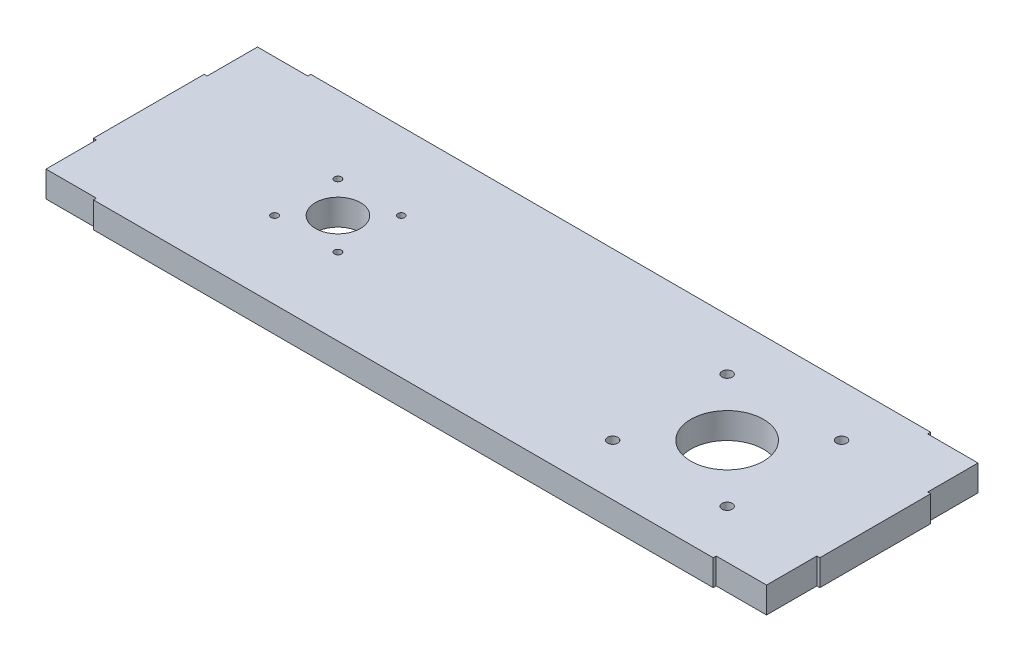
ISO-10303-21;
HEADER;
FILE_DESCRIPTION(('STEP AP214'),'2;1');
FILE_NAME('part.step','',(''),(''),'','','');
FILE_SCHEMA(('AUTOMOTIVE_DESIGN { 1 0 10303 214 1 1 1 1 }'));
ENDSEC;
DATA;
#1=APPLICATION_CONTEXT('core data for automotive mechanical design processes');
#2=APPLICATION_PROTOCOL_DEFINITION('international standard','automotive_design',2000,#1);
#3=PRODUCT_CONTEXT('',#1,'mechanical');
#4=PRODUCT('Part','Part','',(#3));
#5=PRODUCT_RELATED_PRODUCT_CATEGORY('part','',(#4));
#6=PRODUCT_DEFINITION_FORMATION('','',#4);
#7=PRODUCT_DEFINITION_CONTEXT('part definition',#1,'design');
#8=PRODUCT_DEFINITION('design','',#6,#7);
#9=PRODUCT_DEFINITION_SHAPE('','',#8);
#10=(LENGTH_UNIT() NAMED_UNIT(*) SI_UNIT(.MILLI.,.METRE.));
#11=(NAMED_UNIT(*) PLANE_ANGLE_UNIT() SI_UNIT($,.RADIAN.));
#12=(NAMED_UNIT(*) SI_UNIT($,.STERADIAN.) SOLID_ANGLE_UNIT());
#13=UNCERTAINTY_MEASURE_WITH_UNIT(LENGTH_MEASURE(1.E-05),#10,'distance_accuracy_value','');
#14=(GEOMETRIC_REPRESENTATION_CONTEXT(3) GLOBAL_UNCERTAINTY_ASSIGNED_CONTEXT((#13)) GLOBAL_UNIT_ASSIGNED_CONTEXT((#10,
#11,#12)) REPRESENTATION_CONTEXT('',''));
#15=CARTESIAN_POINT('',(0.,0.,0.));
#16=DIRECTION('',(0.,0.,1.));
#17=DIRECTION('',(1.,0.,0.));
#18=AXIS2_PLACEMENT_3D('',#15,#16,#17);
#19=CARTESIAN_POINT('',(-151.7015,12.7,-53.213));
#20=DIRECTION('',(0.,0.,1.));
#21=DIRECTION('',(1.,0.,0.));
#22=AXIS2_PLACEMENT_3D('',#19,#20,#21);
#23=PLANE('',#22);
#24=DIRECTION('',(-1.,0.,0.));
#25=VECTOR('',#24,1.);
#26=CARTESIAN_POINT('',(-151.7015,0.,-53.213));
#27=LINE('',#26,#25);
#28=CARTESIAN_POINT('',(151.7015,0.,-53.213));
#29=VERTEX_POINT('',#28);
#30=CARTESIAN_POINT('',(-151.7015,0.,-53.213));
#31=VERTEX_POINT('',#30);
#32=EDGE_CURVE('E205',#29,#31,#27,.T.);
#33=ORIENTED_EDGE('',*,*,#32,.T.);
#34=DIRECTION('',(0.,-1.,0.));
#35=VECTOR('',#34,1.);
#36=CARTESIAN_POINT('',(-151.7015,12.7,-53.213));
#37=LINE('',#36,#35);
#38=CARTESIAN_POINT('',(-151.7015,12.7,-53.213));
#39=VERTEX_POINT('',#38);
#40=EDGE_CURVE('E11',#39,#31,#37,.T.);
#41=ORIENTED_EDGE('',*,*,#40,.F.);
#42=DIRECTION('',(-1.,0.,0.));
#43=VECTOR('',#42,1.);
#44=CARTESIAN_POINT('',(-151.7015,12.7,-53.213));
#45=LINE('',#44,#43);
#46=CARTESIAN_POINT('',(151.7015,12.7,-53.213));
#47=VERTEX_POINT('',#46);
#48=EDGE_CURVE('E244',#47,#39,#45,.T.);
#49=ORIENTED_EDGE('',*,*,#48,.F.);
#50=DIRECTION('',(0.,-1.,0.));
#51=VECTOR('',#50,1.);
#52=CARTESIAN_POINT('',(151.7015,12.7,-53.213));
#53=LINE('',#52,#51);
#54=EDGE_CURVE('E201',#47,#29,#53,.T.);
#55=ORIENTED_EDGE('',*,*,#54,.T.);
#56=EDGE_LOOP('',(#33,#41,#49,#55));
#57=FACE_BOUND('',#56,.T.);
#58=ADVANCED_FACE('F37',(#57),#23,.F.);
#59=CARTESIAN_POINT('',(-151.7015,12.7,-53.213));
#60=DIRECTION('',(1.,0.,0.));
#61=DIRECTION('',(0.,0.,-1.));
#62=AXIS2_PLACEMENT_3D('',#59,#60,#61);
#63=PLANE('',#62);
#64=DIRECTION('',(0.,0.,1.));
#65=VECTOR('',#64,1.);
#66=CARTESIAN_POINT('',(-151.7015,0.,-53.213));
#67=LINE('',#66,#65);
#68=CARTESIAN_POINT('',(-151.7015,0.,-51.7525));
#69=VERTEX_POINT('',#68);
#70=EDGE_CURVE('E208',#31,#69,#67,.T.);
#71=ORIENTED_EDGE('',*,*,#70,.T.);
#72=DIRECTION('',(0.,-1.,0.));
#73=VECTOR('',#72,1.);
#74=CARTESIAN_POINT('',(-151.7015,12.7,-51.7525));
#75=LINE('',#74,#73);
#76=CARTESIAN_POINT('',(-151.7015,12.7,-51.7525));
#77=VERTEX_POINT('',#76);
#78=EDGE_CURVE('E45',#77,#69,#75,.T.);
#79=ORIENTED_EDGE('',*,*,#78,.F.);
#80=DIRECTION('',(0.,0.,1.));
#81=VECTOR('',#80,1.);
#82=CARTESIAN_POINT('',(-151.7015,12.7,-53.213));
#83=LINE('',#82,#81);
#84=EDGE_CURVE('E132',#39,#77,#83,.T.);
#85=ORIENTED_EDGE('',*,*,#84,.F.);
#86=ORIENTED_EDGE('',*,*,#40,.T.);
#87=EDGE_LOOP('',(#71,#79,#85,#86));
#88=FACE_BOUND('',#87,.T.);
#89=ADVANCED_FACE('F364',(#88),#63,.F.);
#90=CARTESIAN_POINT('',(-151.7015,12.7,-51.7525));
#91=DIRECTION('',(0.,0.,1.));
#92=DIRECTION('',(1.,0.,0.));
#93=AXIS2_PLACEMENT_3D('',#90,#91,#92);
#94=PLANE('',#93);
#95=DIRECTION('',(-1.,0.,0.));
#96=VECTOR('',#95,1.);
#97=CARTESIAN_POINT('',(-151.7015,0.,-51.7525));
#98=LINE('',#97,#96);
#99=CARTESIAN_POINT('',(-176.3395,0.,-51.7525));
#100=VERTEX_POINT('',#99);
#101=EDGE_CURVE('E211',#69,#100,#98,.T.);
#102=ORIENTED_EDGE('',*,*,#101,.T.);
#103=DIRECTION('',(0.,-1.,0.));
#104=VECTOR('',#103,1.);
#105=CARTESIAN_POINT('',(-176.3395,12.7,-51.7525));
#106=LINE('',#105,#104);
#107=CARTESIAN_POINT('',(-176.3395,12.7,-51.7525));
#108=VERTEX_POINT('',#107);
#109=EDGE_CURVE('E287',#108,#100,#106,.T.);
#110=ORIENTED_EDGE('',*,*,#109,.F.);
#111=DIRECTION('',(-1.,0.,0.));
#112=VECTOR('',#111,1.);
#113=CARTESIAN_POINT('',(-151.7015,12.7,-51.7525));
#114=LINE('',#113,#112);
#115=EDGE_CURVE('E295',#77,#108,#114,.T.);
#116=ORIENTED_EDGE('',*,*,#115,.F.);
#117=ORIENTED_EDGE('',*,*,#78,.T.);
#118=EDGE_LOOP('',(#102,#110,#116,#117));
#119=FACE_BOUND('',#118,.T.);
#120=ADVANCED_FACE('F293',(#119),#94,.F.);
#121=CARTESIAN_POINT('',(-176.3395,12.7,-51.7525));
#122=DIRECTION('',(1.,0.,0.));
#123=DIRECTION('',(0.,0.,-1.));
#124=AXIS2_PLACEMENT_3D('',#121,#122,#123);
#125=PLANE('',#124);
#126=DIRECTION('',(0.,0.,1.));
#127=VECTOR('',#126,1.);
#128=CARTESIAN_POINT('',(-176.3395,0.,-51.7525));
#129=LINE('',#128,#127);
#130=CARTESIAN_POINT('',(-176.3395,0.,-27.1145));
#131=VERTEX_POINT('',#130);
#132=EDGE_CURVE('E213',#100,#131,#129,.T.);
#133=ORIENTED_EDGE('',*,*,#132,.T.);
#134=DIRECTION('',(0.,-1.,0.));
#135=VECTOR('',#134,1.);
#136=CARTESIAN_POINT('',(-176.3395,12.7,-27.1145));
#137=LINE('',#136,#135);
#138=CARTESIAN_POINT('',(-176.3395,12.7,-27.1145));
#139=VERTEX_POINT('',#138);
#140=EDGE_CURVE('E284',#139,#131,#137,.T.);
#141=ORIENTED_EDGE('',*,*,#140,.F.);
#142=DIRECTION('',(0.,0.,1.));
#143=VECTOR('',#142,1.);
#144=CARTESIAN_POINT('',(-176.3395,12.7,-51.7525));
#145=LINE('',#144,#143);
#146=EDGE_CURVE('E313',#108,#139,#145,.T.);
#147=ORIENTED_EDGE('',*,*,#146,.F.);
#148=ORIENTED_EDGE('',*,*,#109,.T.);
#149=EDGE_LOOP('',(#133,#141,#147,#148));
#150=FACE_BOUND('',#149,.T.);
#151=ADVANCED_FACE('F304',(#150),#125,.F.);
#152=CARTESIAN_POINT('',(-176.3395,12.7,-27.1145));
#153=DIRECTION('',(0.,0.,1.));
#154=DIRECTION('',(1.,0.,0.));
#155=AXIS2_PLACEMENT_3D('',#152,#153,#154);
#156=PLANE('',#155);
#157=DIRECTION('',(-1.,0.,0.));
#158=VECTOR('',#157,1.);
#159=CARTESIAN_POINT('',(-176.3395,0.,-27.1145));
#160=LINE('',#159,#158);
#161=CARTESIAN_POINT('',(-177.8,0.,-27.1145));
#162=VERTEX_POINT('',#161);
#163=EDGE_CURVE('E215',#131,#162,#160,.T.);
#164=ORIENTED_EDGE('',*,*,#163,.T.);
#165=DIRECTION('',(0.,-1.,0.));
#166=VECTOR('',#165,1.);
#167=CARTESIAN_POINT('',(-177.8,12.7,-27.1145));
#168=LINE('',#167,#166);
#169=CARTESIAN_POINT('',(-177.8,12.7,-27.1145));
#170=VERTEX_POINT('',#169);
#171=EDGE_CURVE('E281',#170,#162,#168,.T.);
#172=ORIENTED_EDGE('',*,*,#171,.F.);
#173=DIRECTION('',(-1.,0.,0.));
#174=VECTOR('',#173,1.);
#175=CARTESIAN_POINT('',(-176.3395,12.7,-27.1145));
#176=LINE('',#175,#174);
#177=EDGE_CURVE('E310',#139,#170,#176,.T.);
#178=ORIENTED_EDGE('',*,*,#177,.F.);
#179=ORIENTED_EDGE('',*,*,#140,.T.);
#180=EDGE_LOOP('',(#164,#172,#178,#179));
#181=FACE_BOUND('',#180,.T.);
#182=ADVANCED_FACE('F308',(#181),#156,.F.);
#183=CARTESIAN_POINT('',(-177.8,12.7,-27.1145));
#184=DIRECTION('',(1.,0.,0.));
#185=DIRECTION('',(0.,0.,-1.));
#186=AXIS2_PLACEMENT_3D('',#183,#184,#185);
#187=PLANE('',#186);
#188=DIRECTION('',(0.,0.,1.));
#189=VECTOR('',#188,1.);
#190=CARTESIAN_POINT('',(-177.8,0.,-27.1145));
#191=LINE('',#190,#189);
#192=CARTESIAN_POINT('',(-177.8,0.,27.1145));
#193=VERTEX_POINT('',#192);
#194=EDGE_CURVE('E217',#162,#193,#191,.T.);
#195=ORIENTED_EDGE('',*,*,#194,.T.);
#196=DIRECTION('',(0.,-1.,0.));
#197=VECTOR('',#196,1.);
#198=CARTESIAN_POINT('',(-177.8,12.7,27.1145));
#199=LINE('',#198,#197);
#200=CARTESIAN_POINT('',(-177.8,12.7,27.1145));
#201=VERTEX_POINT('',#200);
#202=EDGE_CURVE('E278',#201,#193,#199,.T.);
#203=ORIENTED_EDGE('',*,*,#202,.F.);
#204=DIRECTION('',(0.,0.,1.));
#205=VECTOR('',#204,1.);
#206=CARTESIAN_POINT('',(-177.8,12.7,-27.1145));
#207=LINE('',#206,#205);
#208=EDGE_CURVE('E312',#170,#201,#207,.T.);
#209=ORIENTED_EDGE('',*,*,#208,.F.);
#210=ORIENTED_EDGE('',*,*,#171,.T.);
#211=EDGE_LOOP('',(#195,#203,#209,#210));
#212=FACE_BOUND('',#211,.T.);
#213=ADVANCED_FACE('F377',(#212),#187,.F.);
#214=CARTESIAN_POINT('',(-176.3395,12.7,27.1145));
#215=DIRECTION('',(0.,0.,-1.));
#216=DIRECTION('',(-1.,0.,0.));
#217=AXIS2_PLACEMENT_3D('',#214,#215,#216);
#218=PLANE('',#217);
#219=DIRECTION('',(1.,0.,0.));
#220=VECTOR('',#219,1.);
#221=CARTESIAN_POINT('',(-176.3395,0.,27.1145));
#222=LINE('',#221,#220);
#223=CARTESIAN_POINT('',(-176.3395,0.,27.1145));
#224=VERTEX_POINT('',#223);
#225=EDGE_CURVE('E219',#193,#224,#222,.T.);
#226=ORIENTED_EDGE('',*,*,#225,.T.);
#227=DIRECTION('',(0.,-1.,0.));
#228=VECTOR('',#227,1.);
#229=CARTESIAN_POINT('',(-176.3395,12.7,27.1145));
#230=LINE('',#229,#228);
#231=CARTESIAN_POINT('',(-176.3395,12.7,27.1145));
#232=VERTEX_POINT('',#231);
#233=EDGE_CURVE('E275',#232,#224,#230,.T.);
#234=ORIENTED_EDGE('',*,*,#233,.F.);
#235=DIRECTION('',(1.,0.,0.));
#236=VECTOR('',#235,1.);
#237=CARTESIAN_POINT('',(-176.3395,12.7,27.1145));
#238=LINE('',#237,#236);
#239=EDGE_CURVE('E315',#201,#232,#238,.T.);
#240=ORIENTED_EDGE('',*,*,#239,.F.);
#241=ORIENTED_EDGE('',*,*,#202,.T.);
#242=EDGE_LOOP('',(#226,#234,#240,#241));
#243=FACE_BOUND('',#242,.T.);
#244=ADVANCED_FACE('F380',(#243),#218,.F.);
#245=CARTESIAN_POINT('',(-176.3395,12.7,51.7525));
#246=DIRECTION('',(1.,0.,0.));
#247=DIRECTION('',(0.,0.,-1.));
#248=AXIS2_PLACEMENT_3D('',#245,#246,#247);
#249=PLANE('',#248);
#250=DIRECTION('',(0.,0.,1.));
#251=VECTOR('',#250,1.);
#252=CARTESIAN_POINT('',(-176.3395,0.,51.7525));
#253=LINE('',#252,#251);
#254=CARTESIAN_POINT('',(-176.3395,0.,51.7525));
#255=VERTEX_POINT('',#254);
#256=EDGE_CURVE('E221',#224,#255,#253,.T.);
#257=ORIENTED_EDGE('',*,*,#256,.T.);
#258=DIRECTION('',(0.,-1.,0.));
#259=VECTOR('',#258,1.);
#260=CARTESIAN_POINT('',(-176.3395,12.7,51.7525));
#261=LINE('',#260,#259);
#262=CARTESIAN_POINT('',(-176.3395,12.7,51.7525));
#263=VERTEX_POINT('',#262);
#264=EDGE_CURVE('E272',#263,#255,#261,.T.);
#265=ORIENTED_EDGE('',*,*,#264,.F.);
#266=DIRECTION('',(0.,0.,1.));
#267=VECTOR('',#266,1.);
#268=CARTESIAN_POINT('',(-176.3395,12.7,51.7525));
#269=LINE('',#268,#267);
#270=EDGE_CURVE('E321',#232,#263,#269,.T.);
#271=ORIENTED_EDGE('',*,*,#270,.F.);
#272=ORIENTED_EDGE('',*,*,#233,.T.);
#273=EDGE_LOOP('',(#257,#265,#271,#272));
#274=FACE_BOUND('',#273,.T.);
#275=ADVANCED_FACE('F384',(#274),#249,.F.);
#276=CARTESIAN_POINT('',(-151.7015,12.7,51.7525));
#277=DIRECTION('',(0.,0.,-1.));
#278=DIRECTION('',(-1.,0.,0.));
#279=AXIS2_PLACEMENT_3D('',#276,#277,#278);
#280=PLANE('',#279);
#281=DIRECTION('',(1.,0.,0.));
#282=VECTOR('',#281,1.);
#283=CARTESIAN_POINT('',(-151.7015,0.,51.7525));
#284=LINE('',#283,#282);
#285=CARTESIAN_POINT('',(-151.7015,0.,51.7525));
#286=VERTEX_POINT('',#285);
#287=EDGE_CURVE('E223',#255,#286,#284,.T.);
#288=ORIENTED_EDGE('',*,*,#287,.T.);
#289=DIRECTION('',(0.,-1.,0.));
#290=VECTOR('',#289,1.);
#291=CARTESIAN_POINT('',(-151.7015,12.7,51.7525));
#292=LINE('',#291,#290);
#293=CARTESIAN_POINT('',(-151.7015,12.7,51.7525));
#294=VERTEX_POINT('',#293);
#295=EDGE_CURVE('E269',#294,#286,#292,.T.);
#296=ORIENTED_EDGE('',*,*,#295,.F.);
#297=DIRECTION('',(1.,0.,0.));
#298=VECTOR('',#297,1.);
#299=CARTESIAN_POINT('',(-151.7015,12.7,51.7525));
#300=LINE('',#299,#298);
#301=EDGE_CURVE('E323',#263,#294,#300,.T.);
#302=ORIENTED_EDGE('',*,*,#301,.F.);
#303=ORIENTED_EDGE('',*,*,#264,.T.);
#304=EDGE_LOOP('',(#288,#296,#302,#303));
#305=FACE_BOUND('',#304,.T.);
#306=ADVANCED_FACE('F388',(#305),#280,.F.);
#307=CARTESIAN_POINT('',(-151.7015,12.7,53.213));
#308=DIRECTION('',(1.,0.,0.));
#309=DIRECTION('',(0.,0.,-1.));
#310=AXIS2_PLACEMENT_3D('',#307,#308,#309);
#311=PLANE('',#310);
#312=DIRECTION('',(0.,0.,1.));
#313=VECTOR('',#312,1.);
#314=CARTESIAN_POINT('',(-151.7015,0.,53.213));
#315=LINE('',#314,#313);
#316=CARTESIAN_POINT('',(-151.7015,0.,53.213));
#317=VERTEX_POINT('',#316);
#318=EDGE_CURVE('E225',#286,#317,#315,.T.);
#319=ORIENTED_EDGE('',*,*,#318,.T.);
#320=DIRECTION('',(0.,-1.,0.));
#321=VECTOR('',#320,1.);
#322=CARTESIAN_POINT('',(-151.7015,12.7,53.213));
#323=LINE('',#322,#321);
#324=CARTESIAN_POINT('',(-151.7015,12.7,53.213));
#325=VERTEX_POINT('',#324);
#326=EDGE_CURVE('E266',#325,#317,#323,.T.);
#327=ORIENTED_EDGE('',*,*,#326,.F.);
#328=DIRECTION('',(0.,0.,1.));
#329=VECTOR('',#328,1.);
#330=CARTESIAN_POINT('',(-151.7015,12.7,53.213));
#331=LINE('',#330,#329);
#332=EDGE_CURVE('E325',#294,#325,#331,.T.);
#333=ORIENTED_EDGE('',*,*,#332,.F.);
#334=ORIENTED_EDGE('',*,*,#295,.T.);
#335=EDGE_LOOP('',(#319,#327,#333,#334));
#336=FACE_BOUND('',#335,.T.);
#337=ADVANCED_FACE('F392',(#336),#311,.F.);
#338=CARTESIAN_POINT('',(-151.7015,12.7,53.213));
#339=DIRECTION('',(0.,0.,-1.));
#340=DIRECTION('',(-1.,0.,0.));
#341=AXIS2_PLACEMENT_3D('',#338,#339,#340);
#342=PLANE('',#341);
#343=DIRECTION('',(1.,0.,0.));
#344=VECTOR('',#343,1.);
#345=CARTESIAN_POINT('',(-151.7015,0.,53.213));
#346=LINE('',#345,#344);
#347=CARTESIAN_POINT('',(151.7015,0.,53.213));
#348=VERTEX_POINT('',#347);
#349=EDGE_CURVE('E227',#317,#348,#346,.T.);
#350=ORIENTED_EDGE('',*,*,#349,.T.);
#351=DIRECTION('',(0.,-1.,0.));
#352=VECTOR('',#351,1.);
#353=CARTESIAN_POINT('',(151.7015,12.7,53.213));
#354=LINE('',#353,#352);
#355=CARTESIAN_POINT('',(151.7015,12.7,53.213));
#356=VERTEX_POINT('',#355);
#357=EDGE_CURVE('E263',#356,#348,#354,.T.);
#358=ORIENTED_EDGE('',*,*,#357,.F.);
#359=DIRECTION('',(1.,0.,0.));
#360=VECTOR('',#359,1.);
#361=CARTESIAN_POINT('',(-151.7015,12.7,53.213));
#362=LINE('',#361,#360);
#363=EDGE_CURVE('E327',#325,#356,#362,.T.);
#364=ORIENTED_EDGE('',*,*,#363,.F.);
#365=ORIENTED_EDGE('',*,*,#326,.T.);
#366=EDGE_LOOP('',(#350,#358,#364,#365));
#367=FACE_BOUND('',#366,.T.);
#368=ADVANCED_FACE('F396',(#367),#342,.F.);
#369=CARTESIAN_POINT('',(151.7015,12.7,53.213));
#370=DIRECTION('',(-1.,0.,0.));
#371=DIRECTION('',(0.,0.,1.));
#372=AXIS2_PLACEMENT_3D('',#369,#370,#371);
#373=PLANE('',#372);
#374=DIRECTION('',(0.,0.,-1.));
#375=VECTOR('',#374,1.);
#376=CARTESIAN_POINT('',(151.7015,0.,53.213));
#377=LINE('',#376,#375);
#378=CARTESIAN_POINT('',(151.7015,0.,51.7525));
#379=VERTEX_POINT('',#378);
#380=EDGE_CURVE('E229',#348,#379,#377,.T.);
#381=ORIENTED_EDGE('',*,*,#380,.T.);
#382=DIRECTION('',(0.,-1.,0.));
#383=VECTOR('',#382,1.);
#384=CARTESIAN_POINT('',(151.7015,12.7,51.7525));
#385=LINE('',#384,#383);
#386=CARTESIAN_POINT('',(151.7015,12.7,51.7525));
#387=VERTEX_POINT('',#386);
#388=EDGE_CURVE('E260',#387,#379,#385,.T.);
#389=ORIENTED_EDGE('',*,*,#388,.F.);
#390=DIRECTION('',(0.,0.,-1.));
#391=VECTOR('',#390,1.);
#392=CARTESIAN_POINT('',(151.7015,12.7,53.213));
#393=LINE('',#392,#391);
#394=EDGE_CURVE('E329',#356,#387,#393,.T.);
#395=ORIENTED_EDGE('',*,*,#394,.F.);
#396=ORIENTED_EDGE('',*,*,#357,.T.);
#397=EDGE_LOOP('',(#381,#389,#395,#396));
#398=FACE_BOUND('',#397,.T.);
#399=ADVANCED_FACE('F400',(#398),#373,.F.);
#400=CARTESIAN_POINT('',(151.7015,12.7,51.7525));
#401=DIRECTION('',(0.,0.,-1.));
#402=DIRECTION('',(-1.,0.,0.));
#403=AXIS2_PLACEMENT_3D('',#400,#401,#402);
#404=PLANE('',#403);
#405=DIRECTION('',(1.,0.,0.));
#406=VECTOR('',#405,1.);
#407=CARTESIAN_POINT('',(151.7015,0.,51.7525));
#408=LINE('',#407,#406);
#409=CARTESIAN_POINT('',(176.3395,0.,51.7525));
#410=VERTEX_POINT('',#409);
#411=EDGE_CURVE('E231',#379,#410,#408,.T.);
#412=ORIENTED_EDGE('',*,*,#411,.T.);
#413=DIRECTION('',(0.,-1.,0.));
#414=VECTOR('',#413,1.);
#415=CARTESIAN_POINT('',(176.3395,12.7,51.7525));
#416=LINE('',#415,#414);
#417=CARTESIAN_POINT('',(176.3395,12.7,51.7525));
#418=VERTEX_POINT('',#417);
#419=EDGE_CURVE('E257',#418,#410,#416,.T.);
#420=ORIENTED_EDGE('',*,*,#419,.F.);
#421=DIRECTION('',(1.,0.,0.));
#422=VECTOR('',#421,1.);
#423=CARTESIAN_POINT('',(151.7015,12.7,51.7525));
#424=LINE('',#423,#422);
#425=EDGE_CURVE('E331',#387,#418,#424,.T.);
#426=ORIENTED_EDGE('',*,*,#425,.F.);
#427=ORIENTED_EDGE('',*,*,#388,.T.);
#428=EDGE_LOOP('',(#412,#420,#426,#427));
#429=FACE_BOUND('',#428,.T.);
#430=ADVANCED_FACE('F404',(#429),#404,.F.);
#431=CARTESIAN_POINT('',(176.3395,12.7,51.7525));
#432=DIRECTION('',(-1.,0.,0.));
#433=DIRECTION('',(0.,0.,1.));
#434=AXIS2_PLACEMENT_3D('',#431,#432,#433);
#435=PLANE('',#434);
#436=DIRECTION('',(0.,0.,-1.));
#437=VECTOR('',#436,1.);
#438=CARTESIAN_POINT('',(176.3395,0.,51.7525));
#439=LINE('',#438,#437);
#440=CARTESIAN_POINT('',(176.3395,0.,27.1145));
#441=VERTEX_POINT('',#440);
#442=EDGE_CURVE('E233',#410,#441,#439,.T.);
#443=ORIENTED_EDGE('',*,*,#442,.T.);
#444=DIRECTION('',(0.,-1.,0.));
#445=VECTOR('',#444,1.);
#446=CARTESIAN_POINT('',(176.3395,12.7,27.1145));
#447=LINE('',#446,#445);
#448=CARTESIAN_POINT('',(176.3395,12.7,27.1145));
#449=VERTEX_POINT('',#448);
#450=EDGE_CURVE('E254',#449,#441,#447,.T.);
#451=ORIENTED_EDGE('',*,*,#450,.F.);
#452=DIRECTION('',(0.,0.,-1.));
#453=VECTOR('',#452,1.);
#454=CARTESIAN_POINT('',(176.3395,12.7,51.7525));
#455=LINE('',#454,#453);
#456=EDGE_CURVE('E333',#418,#449,#455,.T.);
#457=ORIENTED_EDGE('',*,*,#456,.F.);
#458=ORIENTED_EDGE('',*,*,#419,.T.);
#459=EDGE_LOOP('',(#443,#451,#457,#458));
#460=FACE_BOUND('',#459,.T.);
#461=ADVANCED_FACE('F408',(#460),#435,.F.);
#462=CARTESIAN_POINT('',(176.3395,12.7,27.1145));
#463=DIRECTION('',(0.,0.,-1.));
#464=DIRECTION('',(-1.,0.,0.));
#465=AXIS2_PLACEMENT_3D('',#462,#463,#464);
#466=PLANE('',#465);
#467=DIRECTION('',(1.,0.,0.));
#468=VECTOR('',#467,1.);
#469=CARTESIAN_POINT('',(176.3395,0.,27.1145));
#470=LINE('',#469,#468);
#471=CARTESIAN_POINT('',(177.8,0.,27.1145));
#472=VERTEX_POINT('',#471);
#473=EDGE_CURVE('E235',#441,#472,#470,.T.);
#474=ORIENTED_EDGE('',*,*,#473,.T.);
#475=DIRECTION('',(0.,-1.,0.));
#476=VECTOR('',#475,1.);
#477=CARTESIAN_POINT('',(177.8,12.7,27.1145));
#478=LINE('',#477,#476);
#479=CARTESIAN_POINT('',(177.8,12.7,27.1145));
#480=VERTEX_POINT('',#479);
#481=EDGE_CURVE('E251',#480,#472,#478,.T.);
#482=ORIENTED_EDGE('',*,*,#481,.F.);
#483=DIRECTION('',(1.,0.,0.));
#484=VECTOR('',#483,1.);
#485=CARTESIAN_POINT('',(176.3395,12.7,27.1145));
#486=LINE('',#485,#484);
#487=EDGE_CURVE('E335',#449,#480,#486,.T.);
#488=ORIENTED_EDGE('',*,*,#487,.F.);
#489=ORIENTED_EDGE('',*,*,#450,.T.);
#490=EDGE_LOOP('',(#474,#482,#488,#489));
#491=FACE_BOUND('',#490,.T.);
#492=ADVANCED_FACE('F412',(#491),#466,.F.);
#493=CARTESIAN_POINT('',(177.8,12.7,-27.1145));
#494=DIRECTION('',(-1.,0.,0.));
#495=DIRECTION('',(0.,0.,1.));
#496=AXIS2_PLACEMENT_3D('',#493,#494,#495);
#497=PLANE('',#496);
#498=DIRECTION('',(0.,0.,-1.));
#499=VECTOR('',#498,1.);
#500=CARTESIAN_POINT('',(177.8,0.,-27.1145));
#501=LINE('',#500,#499);
#502=CARTESIAN_POINT('',(177.8,0.,-27.1145));
#503=VERTEX_POINT('',#502);
#504=EDGE_CURVE('E237',#472,#503,#501,.T.);
#505=ORIENTED_EDGE('',*,*,#504,.T.);
#506=DIRECTION('',(0.,-1.,0.));
#507=VECTOR('',#506,1.);
#508=CARTESIAN_POINT('',(177.8,12.7,-27.1145));
#509=LINE('',#508,#507);
#510=CARTESIAN_POINT('',(177.8,12.7,-27.1145));
#511=VERTEX_POINT('',#510);
#512=EDGE_CURVE('E248',#511,#503,#509,.T.);
#513=ORIENTED_EDGE('',*,*,#512,.F.);
#514=DIRECTION('',(0.,0.,-1.));
#515=VECTOR('',#514,1.);
#516=CARTESIAN_POINT('',(177.8,12.7,-27.1145));
#517=LINE('',#516,#515);
#518=EDGE_CURVE('E337',#480,#511,#517,.T.);
#519=ORIENTED_EDGE('',*,*,#518,.F.);
#520=ORIENTED_EDGE('',*,*,#481,.T.);
#521=EDGE_LOOP('',(#505,#513,#519,#520));
#522=FACE_BOUND('',#521,.T.);
#523=ADVANCED_FACE('F343',(#522),#497,.F.);
#524=CARTESIAN_POINT('',(176.3395,12.7,-27.1145));
#525=DIRECTION('',(0.,0.,1.));
#526=DIRECTION('',(1.,0.,0.));
#527=AXIS2_PLACEMENT_3D('',#524,#525,#526);
#528=PLANE('',#527);
#529=DIRECTION('',(-1.,0.,0.));
#530=VECTOR('',#529,1.);
#531=CARTESIAN_POINT('',(176.3395,0.,-27.1145));
#532=LINE('',#531,#530);
#533=CARTESIAN_POINT('',(176.3395,0.,-27.1145));
#534=VERTEX_POINT('',#533);
#535=EDGE_CURVE('E239',#503,#534,#532,.T.);
#536=ORIENTED_EDGE('',*,*,#535,.T.);
#537=DIRECTION('',(0.,-1.,0.));
#538=VECTOR('',#537,1.);
#539=CARTESIAN_POINT('',(176.3395,12.7,-27.1145));
#540=LINE('',#539,#538);
#541=CARTESIAN_POINT('',(176.3395,12.7,-27.1145));
#542=VERTEX_POINT('',#541);
#543=EDGE_CURVE('E196',#542,#534,#540,.T.);
#544=ORIENTED_EDGE('',*,*,#543,.F.);
#545=DIRECTION('',(-1.,0.,0.));
#546=VECTOR('',#545,1.);
#547=CARTESIAN_POINT('',(176.3395,12.7,-27.1145));
#548=LINE('',#547,#546);
#549=EDGE_CURVE('E187',#511,#542,#548,.T.);
#550=ORIENTED_EDGE('',*,*,#549,.F.);
#551=ORIENTED_EDGE('',*,*,#512,.T.);
#552=EDGE_LOOP('',(#536,#544,#550,#551));
#553=FACE_BOUND('',#552,.T.);
#554=ADVANCED_FACE('F347',(#553),#528,.F.);
#555=CARTESIAN_POINT('',(176.3395,12.7,-51.7525));
#556=DIRECTION('',(-1.,0.,0.));
#557=DIRECTION('',(0.,0.,1.));
#558=AXIS2_PLACEMENT_3D('',#555,#556,#557);
#559=PLANE('',#558);
#560=DIRECTION('',(0.,0.,-1.));
#561=VECTOR('',#560,1.);
#562=CARTESIAN_POINT('',(176.3395,0.,-51.7525));
#563=LINE('',#562,#561);
#564=CARTESIAN_POINT('',(176.3395,0.,-51.7525));
#565=VERTEX_POINT('',#564);
#566=EDGE_CURVE('E195',#534,#565,#563,.T.);
#567=ORIENTED_EDGE('',*,*,#566,.T.);
#568=DIRECTION('',(0.,-1.,0.));
#569=VECTOR('',#568,1.);
#570=CARTESIAN_POINT('',(176.3395,12.7,-51.7525));
#571=LINE('',#570,#569);
#572=CARTESIAN_POINT('',(176.3395,12.7,-51.7525));
#573=VERTEX_POINT('',#572);
#574=EDGE_CURVE('E192',#573,#565,#571,.T.);
#575=ORIENTED_EDGE('',*,*,#574,.F.);
#576=DIRECTION('',(0.,0.,-1.));
#577=VECTOR('',#576,1.);
#578=CARTESIAN_POINT('',(176.3395,12.7,-51.7525));
#579=LINE('',#578,#577);
#580=EDGE_CURVE('E181',#542,#573,#579,.T.);
#581=ORIENTED_EDGE('',*,*,#580,.F.);
#582=ORIENTED_EDGE('',*,*,#543,.T.);
#583=EDGE_LOOP('',(#567,#575,#581,#582));
#584=FACE_BOUND('',#583,.T.);
#585=ADVANCED_FACE('F193',(#584),#559,.F.);
#586=CARTESIAN_POINT('',(151.7015,12.7,-51.7525));
#587=DIRECTION('',(0.,0.,1.));
#588=DIRECTION('',(1.,0.,0.));
#589=AXIS2_PLACEMENT_3D('',#586,#587,#588);
#590=PLANE('',#589);
#591=DIRECTION('',(-1.,0.,0.));
#592=VECTOR('',#591,1.);
#593=CARTESIAN_POINT('',(151.7015,0.,-51.7525));
#594=LINE('',#593,#592);
#595=CARTESIAN_POINT('',(151.7015,0.,-51.7525));
#596=VERTEX_POINT('',#595);
#597=EDGE_CURVE('E118',#565,#596,#594,.T.);
#598=ORIENTED_EDGE('',*,*,#597,.T.);
#599=DIRECTION('',(0.,-1.,0.));
#600=VECTOR('',#599,1.);
#601=CARTESIAN_POINT('',(151.7015,12.7,-51.7525));
#602=LINE('',#601,#600);
#603=CARTESIAN_POINT('',(151.7015,12.7,-51.7525));
#604=VERTEX_POINT('',#603);
#605=EDGE_CURVE('E197',#604,#596,#602,.T.);
#606=ORIENTED_EDGE('',*,*,#605,.F.);
#607=DIRECTION('',(-1.,0.,0.));
#608=VECTOR('',#607,1.);
#609=CARTESIAN_POINT('',(151.7015,12.7,-51.7525));
#610=LINE('',#609,#608);
#611=EDGE_CURVE('E185',#573,#604,#610,.T.);
#612=ORIENTED_EDGE('',*,*,#611,.F.);
#613=ORIENTED_EDGE('',*,*,#574,.T.);
#614=EDGE_LOOP('',(#598,#606,#612,#613));
#615=FACE_BOUND('',#614,.T.);
#616=ADVANCED_FACE('F199',(#615),#590,.F.);
#617=CARTESIAN_POINT('',(151.7015,12.7,-53.213));
#618=DIRECTION('',(-1.,0.,0.));
#619=DIRECTION('',(0.,0.,1.));
#620=AXIS2_PLACEMENT_3D('',#617,#618,#619);
#621=PLANE('',#620);
#622=DIRECTION('',(0.,0.,-1.));
#623=VECTOR('',#622,1.);
#624=CARTESIAN_POINT('',(151.7015,0.,-53.213));
#625=LINE('',#624,#623);
#626=EDGE_CURVE('E124',#596,#29,#625,.T.);
#627=ORIENTED_EDGE('',*,*,#626,.T.);
#628=ORIENTED_EDGE('',*,*,#54,.F.);
#629=DIRECTION('',(0.,0.,-1.));
#630=VECTOR('',#629,1.);
#631=CARTESIAN_POINT('',(151.7015,12.7,-53.213));
#632=LINE('',#631,#630);
#633=EDGE_CURVE('E53',#604,#47,#632,.T.);
#634=ORIENTED_EDGE('',*,*,#633,.F.);
#635=ORIENTED_EDGE('',*,*,#605,.T.);
#636=EDGE_LOOP('',(#627,#628,#634,#635));
#637=FACE_BOUND('',#636,.T.);
#638=ADVANCED_FACE('F351',(#637),#621,.F.);
#639=CARTESIAN_POINT('',(0.,12.7,0.));
#640=DIRECTION('',(0.,-1.,0.));
#641=DIRECTION('',(0.,0.,-1.));
#642=AXIS2_PLACEMENT_3D('',#639,#640,#641);
#643=PLANE('',#642);
#644=CARTESIAN_POINT('',(105.3,12.7,0.));
#645=DIRECTION('',(0.,1.,0.));
#646=DIRECTION('',(0.,0.,1.));
#647=AXIS2_PLACEMENT_3D('',#644,#645,#646);
#648=CIRCLE('',#647,17.78);
#649=CARTESIAN_POINT('',(105.3,12.7,17.78));
#650=VERTEX_POINT('',#649);
#651=EDGE_CURVE('E553',#650,#650,#648,.T.);
#652=ORIENTED_EDGE('',*,*,#651,.F.);
#653=EDGE_LOOP('',(#652));
#654=FACE_BOUND('',#653,.T.);
#655=CARTESIAN_POINT('',(77.3,12.7,-28.));
#656=DIRECTION('',(0.,1.,0.));
#657=DIRECTION('',(0.,0.,1.));
#658=AXIS2_PLACEMENT_3D('',#655,#656,#657);
#659=CIRCLE('',#658,2.5);
#660=CARTESIAN_POINT('',(77.3,12.7,-25.5));
#661=VERTEX_POINT('',#660);
#662=EDGE_CURVE('E557',#661,#661,#659,.T.);
#663=ORIENTED_EDGE('',*,*,#662,.F.);
#664=EDGE_LOOP('',(#663));
#665=FACE_BOUND('',#664,.T.);
#666=CARTESIAN_POINT('',(133.3,12.7,-28.));
#667=DIRECTION('',(0.,1.,0.));
#668=DIRECTION('',(0.,0.,-1.));
#669=AXIS2_PLACEMENT_3D('',#666,#667,#668);
#670=CIRCLE('',#669,2.5);
#671=CARTESIAN_POINT('',(133.3,12.7,-30.5));
#672=VERTEX_POINT('',#671);
#673=EDGE_CURVE('E570',#672,#672,#670,.T.);
#674=ORIENTED_EDGE('',*,*,#673,.F.);
#675=EDGE_LOOP('',(#674));
#676=FACE_BOUND('',#675,.T.);
#677=CARTESIAN_POINT('',(77.3,12.7,28.));
#678=DIRECTION('',(0.,1.,0.));
#679=DIRECTION('',(0.,0.,-1.));
#680=AXIS2_PLACEMENT_3D('',#677,#678,#679);
#681=CIRCLE('',#680,2.5);
#682=CARTESIAN_POINT('',(77.3,12.7,25.5));
#683=VERTEX_POINT('',#682);
#684=EDGE_CURVE('E563',#683,#683,#681,.T.);
#685=ORIENTED_EDGE('',*,*,#684,.F.);
#686=EDGE_LOOP('',(#685));
#687=FACE_BOUND('',#686,.T.);
#688=CARTESIAN_POINT('',(-85.2000000000001,12.7,0.));
#689=DIRECTION('',(0.,1.,0.));
#690=DIRECTION('',(0.,0.,1.));
#691=AXIS2_PLACEMENT_3D('',#688,#689,#690);
#692=CIRCLE('',#691,11.);
#693=CARTESIAN_POINT('',(-85.2000000000001,12.7,11.));
#694=VERTEX_POINT('',#693);
#695=EDGE_CURVE('E559',#694,#694,#692,.T.);
#696=ORIENTED_EDGE('',*,*,#695,.F.);
#697=EDGE_LOOP('',(#696));
#698=FACE_BOUND('',#697,.T.);
#699=CARTESIAN_POINT('',(-100.7,12.7,-15.5));
#700=DIRECTION('',(0.,1.,0.));
#701=DIRECTION('',(0.,0.,1.));
#702=AXIS2_PLACEMENT_3D('',#699,#700,#701);
#703=CIRCLE('',#702,1.70000000000001);
#704=CARTESIAN_POINT('',(-100.7,12.7,-13.8));
#705=VERTEX_POINT('',#704);
#706=EDGE_CURVE('E581',#705,#705,#703,.T.);
#707=ORIENTED_EDGE('',*,*,#706,.F.);
#708=EDGE_LOOP('',(#707));
#709=FACE_BOUND('',#708,.T.);
#710=CARTESIAN_POINT('',(-69.7000000000001,12.7,-15.5));
#711=DIRECTION('',(0.,1.,0.));
#712=DIRECTION('',(0.,0.,-1.));
#713=AXIS2_PLACEMENT_3D('',#710,#711,#712);
#714=CIRCLE('',#713,1.70000000000001);
#715=CARTESIAN_POINT('',(-69.7000000000001,12.7,-17.2));
#716=VERTEX_POINT('',#715);
#717=EDGE_CURVE('E587',#716,#716,#714,.T.);
#718=ORIENTED_EDGE('',*,*,#717,.F.);
#719=EDGE_LOOP('',(#718));
#720=FACE_BOUND('',#719,.T.);
#721=CARTESIAN_POINT('',(-69.7000000000001,12.7,15.5));
#722=DIRECTION('',(0.,1.,0.));
#723=DIRECTION('',(0.,0.,1.));
#724=AXIS2_PLACEMENT_3D('',#721,#722,#723);
#725=CIRCLE('',#724,1.70000000000001);
#726=CARTESIAN_POINT('',(-69.7000000000001,12.7,17.2));
#727=VERTEX_POINT('',#726);
#728=EDGE_CURVE('E593',#727,#727,#725,.T.);
#729=ORIENTED_EDGE('',*,*,#728,.F.);
#730=EDGE_LOOP('',(#729));
#731=FACE_BOUND('',#730,.T.);
#732=CARTESIAN_POINT('',(-100.7,12.7,15.5));
#733=DIRECTION('',(0.,1.,0.));
#734=DIRECTION('',(0.,0.,-1.));
#735=AXIS2_PLACEMENT_3D('',#732,#733,#734);
#736=CIRCLE('',#735,1.70000000000001);
#737=CARTESIAN_POINT('',(-100.7,12.7,13.8));
#738=VERTEX_POINT('',#737);
#739=EDGE_CURVE('E599',#738,#738,#736,.T.);
#740=ORIENTED_EDGE('',*,*,#739,.F.);
#741=EDGE_LOOP('',(#740));
#742=FACE_BOUND('',#741,.T.);
#743=CARTESIAN_POINT('',(133.3,12.7,28.));
#744=DIRECTION('',(0.,1.,0.));
#745=DIRECTION('',(0.,0.,1.));
#746=AXIS2_PLACEMENT_3D('',#743,#744,#745);
#747=CIRCLE('',#746,2.5);
#748=CARTESIAN_POINT('',(133.3,12.7,30.5));
#749=VERTEX_POINT('',#748);
#750=EDGE_CURVE('E209',#749,#749,#747,.T.);
#751=ORIENTED_EDGE('',*,*,#750,.F.);
#752=EDGE_LOOP('',(#751));
#753=FACE_BOUND('',#752,.T.);
#754=ORIENTED_EDGE('',*,*,#48,.T.);
#755=ORIENTED_EDGE('',*,*,#84,.T.);
#756=ORIENTED_EDGE('',*,*,#115,.T.);
#757=ORIENTED_EDGE('',*,*,#146,.T.);
#758=ORIENTED_EDGE('',*,*,#177,.T.);
#759=ORIENTED_EDGE('',*,*,#208,.T.);
#760=ORIENTED_EDGE('',*,*,#239,.T.);
#761=ORIENTED_EDGE('',*,*,#270,.T.);
#762=ORIENTED_EDGE('',*,*,#301,.T.);
#763=ORIENTED_EDGE('',*,*,#332,.T.);
#764=ORIENTED_EDGE('',*,*,#363,.T.);
#765=ORIENTED_EDGE('',*,*,#394,.T.);
#766=ORIENTED_EDGE('',*,*,#425,.T.);
#767=ORIENTED_EDGE('',*,*,#456,.T.);
#768=ORIENTED_EDGE('',*,*,#487,.T.);
#769=ORIENTED_EDGE('',*,*,#518,.T.);
#770=ORIENTED_EDGE('',*,*,#549,.T.);
#771=ORIENTED_EDGE('',*,*,#580,.T.);
#772=ORIENTED_EDGE('',*,*,#611,.T.);
#773=ORIENTED_EDGE('',*,*,#633,.T.);
#774=EDGE_LOOP('',(#754,#755,#756,#757,#758,#759,#760,#761,#762,#763,#764,#765,#766,#767,#768,
#769,#770,#771,#772,#773));
#775=FACE_BOUND('',#774,.T.);
#776=ADVANCED_FACE('F183',(#654,#665,#676,#687,#698,#709,#720,#731,#742,#753,#775),#643,.F.);
#777=CARTESIAN_POINT('',(0.,0.,0.));
#778=DIRECTION('',(0.,-1.,0.));
#779=DIRECTION('',(0.,0.,-1.));
#780=AXIS2_PLACEMENT_3D('',#777,#778,#779);
#781=PLANE('',#780);
#782=CARTESIAN_POINT('',(105.3,0.,0.));
#783=DIRECTION('',(0.,-1.,0.));
#784=DIRECTION('',(0.,0.,-1.));
#785=AXIS2_PLACEMENT_3D('',#782,#783,#784);
#786=CIRCLE('',#785,17.78);
#787=CARTESIAN_POINT('',(105.3,0.,-17.78));
#788=VERTEX_POINT('',#787);
#789=EDGE_CURVE('E550',#788,#788,#786,.F.);
#790=ORIENTED_EDGE('',*,*,#789,.T.);
#791=EDGE_LOOP('',(#790));
#792=FACE_BOUND('',#791,.T.);
#793=CARTESIAN_POINT('',(77.3,0.,-28.));
#794=DIRECTION('',(0.,-1.,0.));
#795=DIRECTION('',(0.,0.,-1.));
#796=AXIS2_PLACEMENT_3D('',#793,#794,#795);
#797=CIRCLE('',#796,2.5);
#798=CARTESIAN_POINT('',(77.3,0.,-30.5));
#799=VERTEX_POINT('',#798);
#800=EDGE_CURVE('E554',#799,#799,#797,.F.);
#801=ORIENTED_EDGE('',*,*,#800,.T.);
#802=EDGE_LOOP('',(#801));
#803=FACE_BOUND('',#802,.T.);
#804=CARTESIAN_POINT('',(133.3,0.,-28.));
#805=DIRECTION('',(0.,-1.,0.));
#806=DIRECTION('',(0.,0.,-1.));
#807=AXIS2_PLACEMENT_3D('',#804,#805,#806);
#808=CIRCLE('',#807,2.5);
#809=CARTESIAN_POINT('',(133.3,0.,-30.5));
#810=VERTEX_POINT('',#809);
#811=EDGE_CURVE('E573',#810,#810,#808,.F.);
#812=ORIENTED_EDGE('',*,*,#811,.T.);
#813=EDGE_LOOP('',(#812));
#814=FACE_BOUND('',#813,.T.);
#815=CARTESIAN_POINT('',(77.3,0.,28.));
#816=DIRECTION('',(0.,-1.,0.));
#817=DIRECTION('',(0.,0.,-1.));
#818=AXIS2_PLACEMENT_3D('',#815,#816,#817);
#819=CIRCLE('',#818,2.5);
#820=CARTESIAN_POINT('',(77.3,0.,25.5));
#821=VERTEX_POINT('',#820);
#822=EDGE_CURVE('E567',#821,#821,#819,.F.);
#823=ORIENTED_EDGE('',*,*,#822,.T.);
#824=EDGE_LOOP('',(#823));
#825=FACE_BOUND('',#824,.T.);
#826=CARTESIAN_POINT('',(-85.2000000000001,0.,0.));
#827=DIRECTION('',(0.,-1.,0.));
#828=DIRECTION('',(0.,0.,-1.));
#829=AXIS2_PLACEMENT_3D('',#826,#827,#828);
#830=CIRCLE('',#829,11.);
#831=CARTESIAN_POINT('',(-85.2000000000001,0.,-11.));
#832=VERTEX_POINT('',#831);
#833=EDGE_CURVE('E578',#832,#832,#830,.F.);
#834=ORIENTED_EDGE('',*,*,#833,.T.);
#835=EDGE_LOOP('',(#834));
#836=FACE_BOUND('',#835,.T.);
#837=CARTESIAN_POINT('',(-100.7,0.,-15.5));
#838=DIRECTION('',(0.,-1.,0.));
#839=DIRECTION('',(0.,0.,-1.));
#840=AXIS2_PLACEMENT_3D('',#837,#838,#839);
#841=CIRCLE('',#840,1.70000000000001);
#842=CARTESIAN_POINT('',(-100.7,0.,-17.2));
#843=VERTEX_POINT('',#842);
#844=EDGE_CURVE('E584',#843,#843,#841,.F.);
#845=ORIENTED_EDGE('',*,*,#844,.T.);
#846=EDGE_LOOP('',(#845));
#847=FACE_BOUND('',#846,.T.);
#848=CARTESIAN_POINT('',(-69.7000000000001,0.,-15.5));
#849=DIRECTION('',(0.,-1.,0.));
#850=DIRECTION('',(0.,0.,-1.));
#851=AXIS2_PLACEMENT_3D('',#848,#849,#850);
#852=CIRCLE('',#851,1.70000000000001);
#853=CARTESIAN_POINT('',(-69.7000000000001,0.,-17.2));
#854=VERTEX_POINT('',#853);
#855=EDGE_CURVE('E590',#854,#854,#852,.F.);
#856=ORIENTED_EDGE('',*,*,#855,.T.);
#857=EDGE_LOOP('',(#856));
#858=FACE_BOUND('',#857,.T.);
#859=CARTESIAN_POINT('',(-69.7000000000001,0.,15.5));
#860=DIRECTION('',(0.,-1.,0.));
#861=DIRECTION('',(0.,0.,-1.));
#862=AXIS2_PLACEMENT_3D('',#859,#860,#861);
#863=CIRCLE('',#862,1.70000000000001);
#864=CARTESIAN_POINT('',(-69.7000000000001,0.,13.8));
#865=VERTEX_POINT('',#864);
#866=EDGE_CURVE('E596',#865,#865,#863,.F.);
#867=ORIENTED_EDGE('',*,*,#866,.T.);
#868=EDGE_LOOP('',(#867));
#869=FACE_BOUND('',#868,.T.);
#870=CARTESIAN_POINT('',(-100.7,0.,15.5));
#871=DIRECTION('',(0.,-1.,0.));
#872=DIRECTION('',(0.,0.,-1.));
#873=AXIS2_PLACEMENT_3D('',#870,#871,#872);
#874=CIRCLE('',#873,1.70000000000001);
#875=CARTESIAN_POINT('',(-100.7,0.,13.8));
#876=VERTEX_POINT('',#875);
#877=EDGE_CURVE('E613',#876,#876,#874,.F.);
#878=ORIENTED_EDGE('',*,*,#877,.T.);
#879=EDGE_LOOP('',(#878));
#880=FACE_BOUND('',#879,.T.);
#881=CARTESIAN_POINT('',(133.3,0.,28.));
#882=DIRECTION('',(0.,-1.,0.));
#883=DIRECTION('',(0.,0.,-1.));
#884=AXIS2_PLACEMENT_3D('',#881,#882,#883);
#885=CIRCLE('',#884,2.5);
#886=CARTESIAN_POINT('',(133.3,0.,25.5));
#887=VERTEX_POINT('',#886);
#888=EDGE_CURVE('E566',#887,#887,#885,.F.);
#889=ORIENTED_EDGE('',*,*,#888,.T.);
#890=EDGE_LOOP('',(#889));
#891=FACE_BOUND('',#890,.T.);
#892=ORIENTED_EDGE('',*,*,#32,.F.);
#893=ORIENTED_EDGE('',*,*,#626,.F.);
#894=ORIENTED_EDGE('',*,*,#597,.F.);
#895=ORIENTED_EDGE('',*,*,#566,.F.);
#896=ORIENTED_EDGE('',*,*,#535,.F.);
#897=ORIENTED_EDGE('',*,*,#504,.F.);
#898=ORIENTED_EDGE('',*,*,#473,.F.);
#899=ORIENTED_EDGE('',*,*,#442,.F.);
#900=ORIENTED_EDGE('',*,*,#411,.F.);
#901=ORIENTED_EDGE('',*,*,#380,.F.);
#902=ORIENTED_EDGE('',*,*,#349,.F.);
#903=ORIENTED_EDGE('',*,*,#318,.F.);
#904=ORIENTED_EDGE('',*,*,#287,.F.);
#905=ORIENTED_EDGE('',*,*,#256,.F.);
#906=ORIENTED_EDGE('',*,*,#225,.F.);
#907=ORIENTED_EDGE('',*,*,#194,.F.);
#908=ORIENTED_EDGE('',*,*,#163,.F.);
#909=ORIENTED_EDGE('',*,*,#132,.F.);
#910=ORIENTED_EDGE('',*,*,#101,.F.);
#911=ORIENTED_EDGE('',*,*,#70,.F.);
#912=EDGE_LOOP('',(#892,#893,#894,#895,#896,#897,#898,#899,#900,#901,#902,#903,#904,#905,#906,
#907,#908,#909,#910,#911));
#913=FACE_BOUND('',#912,.T.);
#914=ADVANCED_FACE('F299',(#792,#803,#814,#825,#836,#847,#858,#869,#880,#891,#913),#781,.T.);
#915=CARTESIAN_POINT('',(133.3,-0.000999999999999265,28.));
#916=DIRECTION('',(0.,1.,0.));
#917=DIRECTION('',(0.,0.,1.));
#918=AXIS2_PLACEMENT_3D('',#915,#916,#917);
#919=CYLINDRICAL_SURFACE('',#918,2.5);
#920=ORIENTED_EDGE('',*,*,#888,.F.);
#921=EDGE_LOOP('',(#920));
#922=FACE_BOUND('',#921,.T.);
#923=ORIENTED_EDGE('',*,*,#750,.T.);
#924=EDGE_LOOP('',(#923));
#925=FACE_BOUND('',#924,.T.);
#926=ADVANCED_FACE('F445',(#922,#925),#919,.F.);
#927=CARTESIAN_POINT('',(-100.7,-0.000999999999999265,15.5));
#928=DIRECTION('',(0.,1.,0.));
#929=DIRECTION('',(0.,0.,1.));
#930=AXIS2_PLACEMENT_3D('',#927,#928,#929);
#931=CYLINDRICAL_SURFACE('',#930,1.70000000000001);
#932=ORIENTED_EDGE('',*,*,#877,.F.);
#933=EDGE_LOOP('',(#932));
#934=FACE_BOUND('',#933,.T.);
#935=ORIENTED_EDGE('',*,*,#739,.T.);
#936=EDGE_LOOP('',(#935));
#937=FACE_BOUND('',#936,.T.);
#938=ADVANCED_FACE('F453',(#934,#937),#931,.F.);
#939=CARTESIAN_POINT('',(-69.7000000000001,-0.000999999999999265,15.5));
#940=DIRECTION('',(0.,1.,0.));
#941=DIRECTION('',(0.,0.,1.));
#942=AXIS2_PLACEMENT_3D('',#939,#940,#941);
#943=CYLINDRICAL_SURFACE('',#942,1.70000000000001);
#944=ORIENTED_EDGE('',*,*,#866,.F.);
#945=EDGE_LOOP('',(#944));
#946=FACE_BOUND('',#945,.T.);
#947=ORIENTED_EDGE('',*,*,#728,.T.);
#948=EDGE_LOOP('',(#947));
#949=FACE_BOUND('',#948,.T.);
#950=ADVANCED_FACE('F463',(#946,#949),#943,.F.);
#951=CARTESIAN_POINT('',(-69.7000000000001,-0.000999999999999265,-15.5));
#952=DIRECTION('',(0.,1.,0.));
#953=DIRECTION('',(0.,0.,1.));
#954=AXIS2_PLACEMENT_3D('',#951,#952,#953);
#955=CYLINDRICAL_SURFACE('',#954,1.70000000000001);
#956=ORIENTED_EDGE('',*,*,#855,.F.);
#957=EDGE_LOOP('',(#956));
#958=FACE_BOUND('',#957,.T.);
#959=ORIENTED_EDGE('',*,*,#717,.T.);
#960=EDGE_LOOP('',(#959));
#961=FACE_BOUND('',#960,.T.);
#962=ADVANCED_FACE('F473',(#958,#961),#955,.F.);
#963=CARTESIAN_POINT('',(-100.7,-0.000999999999999265,-15.5));
#964=DIRECTION('',(0.,1.,0.));
#965=DIRECTION('',(0.,0.,1.));
#966=AXIS2_PLACEMENT_3D('',#963,#964,#965);
#967=CYLINDRICAL_SURFACE('',#966,1.70000000000001);
#968=ORIENTED_EDGE('',*,*,#844,.F.);
#969=EDGE_LOOP('',(#968));
#970=FACE_BOUND('',#969,.T.);
#971=ORIENTED_EDGE('',*,*,#706,.T.);
#972=EDGE_LOOP('',(#971));
#973=FACE_BOUND('',#972,.T.);
#974=ADVANCED_FACE('F483',(#970,#973),#967,.F.);
#975=CARTESIAN_POINT('',(-85.2000000000001,-0.000999999999999265,0.));
#976=DIRECTION('',(0.,1.,0.));
#977=DIRECTION('',(0.,0.,1.));
#978=AXIS2_PLACEMENT_3D('',#975,#976,#977);
#979=CYLINDRICAL_SURFACE('',#978,11.);
#980=ORIENTED_EDGE('',*,*,#833,.F.);
#981=EDGE_LOOP('',(#980));
#982=FACE_BOUND('',#981,.T.);
#983=ORIENTED_EDGE('',*,*,#695,.T.);
#984=EDGE_LOOP('',(#983));
#985=FACE_BOUND('',#984,.T.);
#986=ADVANCED_FACE('F493',(#982,#985),#979,.F.);
#987=CARTESIAN_POINT('',(77.3,-0.000999999999999265,28.));
#988=DIRECTION('',(0.,1.,0.));
#989=DIRECTION('',(0.,0.,1.));
#990=AXIS2_PLACEMENT_3D('',#987,#988,#989);
#991=CYLINDRICAL_SURFACE('',#990,2.5);
#992=ORIENTED_EDGE('',*,*,#822,.F.);
#993=EDGE_LOOP('',(#992));
#994=FACE_BOUND('',#993,.T.);
#995=ORIENTED_EDGE('',*,*,#684,.T.);
#996=EDGE_LOOP('',(#995));
#997=FACE_BOUND('',#996,.T.);
#998=ADVANCED_FACE('F503',(#994,#997),#991,.F.);
#999=CARTESIAN_POINT('',(133.3,-0.000999999999999265,-28.));
#1000=DIRECTION('',(0.,1.,0.));
#1001=DIRECTION('',(0.,0.,1.));
#1002=AXIS2_PLACEMENT_3D('',#999,#1000,#1001);
#1003=CYLINDRICAL_SURFACE('',#1002,2.5);
#1004=ORIENTED_EDGE('',*,*,#811,.F.);
#1005=EDGE_LOOP('',(#1004));
#1006=FACE_BOUND('',#1005,.T.);
#1007=ORIENTED_EDGE('',*,*,#673,.T.);
#1008=EDGE_LOOP('',(#1007));
#1009=FACE_BOUND('',#1008,.T.);
#1010=ADVANCED_FACE('F513',(#1006,#1009),#1003,.F.);
#1011=CARTESIAN_POINT('',(77.3,-0.000999999999999265,-28.));
#1012=DIRECTION('',(0.,1.,0.));
#1013=DIRECTION('',(0.,0.,1.));
#1014=AXIS2_PLACEMENT_3D('',#1011,#1012,#1013);
#1015=CYLINDRICAL_SURFACE('',#1014,2.5);
#1016=ORIENTED_EDGE('',*,*,#800,.F.);
#1017=EDGE_LOOP('',(#1016));
#1018=FACE_BOUND('',#1017,.T.);
#1019=ORIENTED_EDGE('',*,*,#662,.T.);
#1020=EDGE_LOOP('',(#1019));
#1021=FACE_BOUND('',#1020,.T.);
#1022=ADVANCED_FACE('F523',(#1018,#1021),#1015,.F.);
#1023=CARTESIAN_POINT('',(105.3,-0.000999999999999265,0.));
#1024=DIRECTION('',(0.,1.,0.));
#1025=DIRECTION('',(0.,0.,1.));
#1026=AXIS2_PLACEMENT_3D('',#1023,#1024,#1025);
#1027=CYLINDRICAL_SURFACE('',#1026,17.78);
#1028=ORIENTED_EDGE('',*,*,#789,.F.);
#1029=EDGE_LOOP('',(#1028));
#1030=FACE_BOUND('',#1029,.T.);
#1031=ORIENTED_EDGE('',*,*,#651,.T.);
#1032=EDGE_LOOP('',(#1031));
#1033=FACE_BOUND('',#1032,.T.);
#1034=ADVANCED_FACE('F533',(#1030,#1033),#1027,.F.);
#1035=CLOSED_SHELL('',(#58,#89,#120,#151,#182,#213,#244,#275,#306,#337,#368,#399,#430,#461,#492,
#523,#554,#585,#616,#638,#776,#914,#926,#938,#950,#962,#974,#986,#998,#1010,#1022,#1034));
#1036=MANIFOLD_SOLID_BREP('B2',#1035);
#1037=ADVANCED_BREP_SHAPE_REPRESENTATION('',(#18,#1036),#14);
#1038=SHAPE_DEFINITION_REPRESENTATION(#9,#1037);
ENDSEC;
END-ISO-10303-21;
